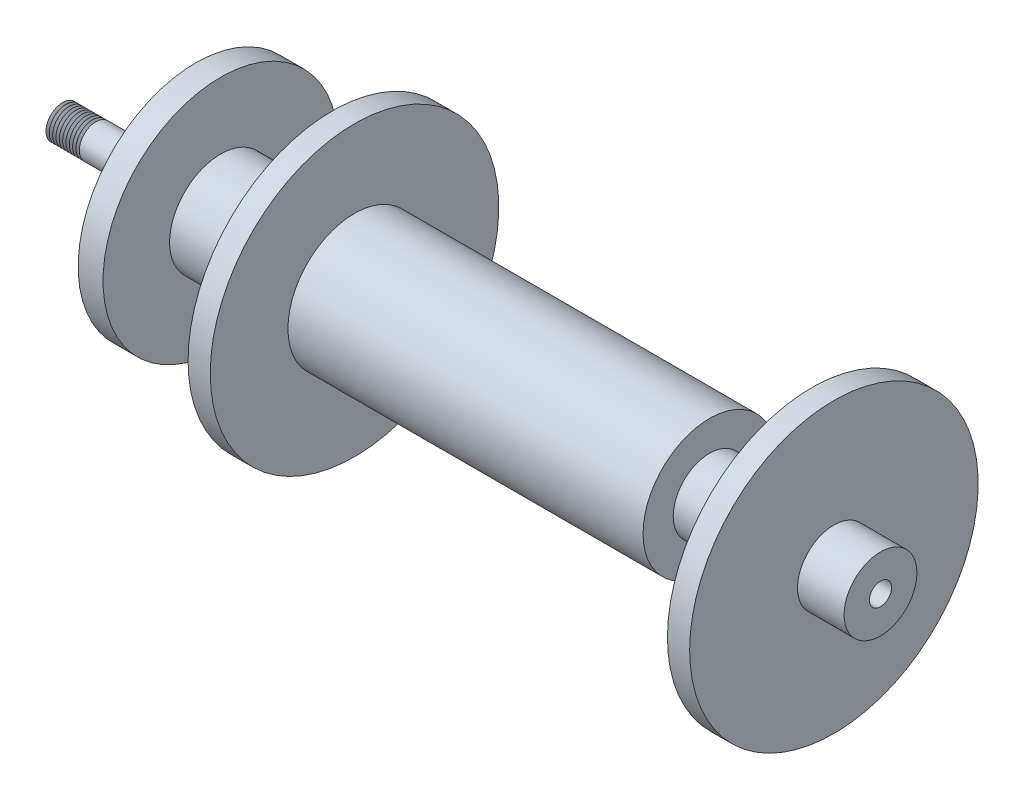
ISO-10303-21;
HEADER;
FILE_DESCRIPTION(('STEP AP214'),'2;1');
FILE_NAME('part.step','',(''),(''),'','','');
FILE_SCHEMA(('AUTOMOTIVE_DESIGN { 1 0 10303 214 1 1 1 1 }'));
ENDSEC;
DATA;
#1=APPLICATION_CONTEXT('core data for automotive mechanical design processes');
#2=APPLICATION_PROTOCOL_DEFINITION('international standard','automotive_design',2000,#1);
#3=PRODUCT_CONTEXT('',#1,'mechanical');
#4=PRODUCT('Part','Part','',(#3));
#5=PRODUCT_RELATED_PRODUCT_CATEGORY('part','',(#4));
#6=PRODUCT_DEFINITION_FORMATION('','',#4);
#7=PRODUCT_DEFINITION_CONTEXT('part definition',#1,'design');
#8=PRODUCT_DEFINITION('design','',#6,#7);
#9=PRODUCT_DEFINITION_SHAPE('','',#8);
#10=(LENGTH_UNIT() NAMED_UNIT(*) SI_UNIT(.MILLI.,.METRE.));
#11=(NAMED_UNIT(*) PLANE_ANGLE_UNIT() SI_UNIT($,.RADIAN.));
#12=(NAMED_UNIT(*) SI_UNIT($,.STERADIAN.) SOLID_ANGLE_UNIT());
#13=UNCERTAINTY_MEASURE_WITH_UNIT(LENGTH_MEASURE(1.E-05),#10,'distance_accuracy_value','');
#14=(GEOMETRIC_REPRESENTATION_CONTEXT(3) GLOBAL_UNCERTAINTY_ASSIGNED_CONTEXT((#13)) GLOBAL_UNIT_ASSIGNED_CONTEXT((#10,
#11,#12)) REPRESENTATION_CONTEXT('',''));
#15=CARTESIAN_POINT('',(0.,0.,0.));
#16=DIRECTION('',(0.,0.,1.));
#17=DIRECTION('',(1.,0.,0.));
#18=AXIS2_PLACEMENT_3D('',#15,#16,#17);
#19=CARTESIAN_POINT('',(-76.0835524418026,0.,0.));
#20=DIRECTION('',(-1.,0.,0.));
#21=DIRECTION('',(0.,0.,1.));
#22=AXIS2_PLACEMENT_3D('',#19,#20,#21);
#23=TOROIDAL_SURFACE('',#22,17.9999865437867,3.00000000000001);
#24=CARTESIAN_POINT('',(-76.0835524418026,0.,20.9999865437867));
#25=VERTEX_POINT('',#24);
#26=VERTEX_LOOP('',#25);
#27=FACE_BOUND('',#26,.T.);
#28=ADVANCED_FACE('F40',(#27),#23,.T.);
#29=CLOSED_SHELL('',(#28));
#30=MANIFOLD_SOLID_BREP('B2',#29);
#31=CARTESIAN_POINT('',(-82.0835524418026,0.,0.));
#32=DIRECTION('',(-1.,0.,0.));
#33=DIRECTION('',(0.,0.,1.));
#34=AXIS2_PLACEMENT_3D('',#31,#32,#33);
#35=TOROIDAL_SURFACE('',#34,17.9999865437867,3.00000000000001);
#36=CARTESIAN_POINT('',(-82.0835524418026,0.,20.9999865437867));
#37=VERTEX_POINT('',#36);
#38=VERTEX_LOOP('',#37);
#39=FACE_BOUND('',#38,.T.);
#40=ADVANCED_FACE('F61',(#39),#35,.T.);
#41=CLOSED_SHELL('',(#40));
#42=MANIFOLD_SOLID_BREP('B6',#41);
#43=CARTESIAN_POINT('',(-198.024312559858,0.,0.));
#44=DIRECTION('',(-1.,0.,0.));
#45=DIRECTION('',(0.,0.,1.));
#46=AXIS2_PLACEMENT_3D('',#43,#44,#45);
#47=CONICAL_SURFACE('',#46,7.50000000000006,1.0471975511966);
#48=CARTESIAN_POINT('',(-197.274312559858,0.,0.));
#49=DIRECTION('',(1.,0.,0.));
#50=DIRECTION('',(0.,0.,-1.));
#51=AXIS2_PLACEMENT_3D('',#48,#49,#50);
#52=CIRCLE('',#51,6.20096189432334);
#53=CARTESIAN_POINT('',(-197.274312559858,0.,-6.20096189432334));
#54=VERTEX_POINT('',#53);
#55=EDGE_CURVE('E169',#54,#54,#52,.T.);
#56=ORIENTED_EDGE('',*,*,#55,.F.);
#57=EDGE_LOOP('',(#56));
#58=FACE_BOUND('',#57,.T.);
#59=CARTESIAN_POINT('',(-198.024312559858,0.,0.));
#60=DIRECTION('',(1.,0.,0.));
#61=DIRECTION('',(0.,0.,-1.));
#62=AXIS2_PLACEMENT_3D('',#59,#60,#61);
#63=CIRCLE('',#62,7.50000000000006);
#64=CARTESIAN_POINT('',(-198.024312559858,0.,-7.50000000000006));
#65=VERTEX_POINT('',#64);
#66=EDGE_CURVE('E60',#65,#65,#63,.T.);
#67=ORIENTED_EDGE('',*,*,#66,.T.);
#68=EDGE_LOOP('',(#67));
#69=FACE_BOUND('',#68,.T.);
#70=ADVANCED_FACE('F81',(#58,#69),#47,.T.);
#71=CARTESIAN_POINT('',(-198.774312559858,0.,0.));
#72=DIRECTION('',(1.,0.,0.));
#73=DIRECTION('',(0.,0.,-1.));
#74=AXIS2_PLACEMENT_3D('',#71,#72,#73);
#75=CONICAL_SURFACE('',#74,6.20096189432333,1.04719755119664);
#76=ORIENTED_EDGE('',*,*,#66,.F.);
#77=EDGE_LOOP('',(#76));
#78=FACE_BOUND('',#77,.T.);
#79=CARTESIAN_POINT('',(-198.774312559858,0.,0.));
#80=DIRECTION('',(1.,0.,0.));
#81=DIRECTION('',(0.,0.,-1.));
#82=AXIS2_PLACEMENT_3D('',#79,#80,#81);
#83=CIRCLE('',#82,6.20096189432333);
#84=CARTESIAN_POINT('',(-198.774312559858,0.,-6.20096189432333));
#85=VERTEX_POINT('',#84);
#86=EDGE_CURVE('E87',#85,#85,#83,.T.);
#87=ORIENTED_EDGE('',*,*,#86,.T.);
#88=EDGE_LOOP('',(#87));
#89=FACE_BOUND('',#88,.T.);
#90=ADVANCED_FACE('F176',(#78,#89),#75,.T.);
#91=CARTESIAN_POINT('',(-199.524312559858,0.,0.));
#92=DIRECTION('',(-1.,0.,0.));
#93=DIRECTION('',(0.,0.,1.));
#94=AXIS2_PLACEMENT_3D('',#91,#92,#93);
#95=CONICAL_SURFACE('',#94,7.50000000000006,1.0471975511966);
#96=ORIENTED_EDGE('',*,*,#86,.F.);
#97=EDGE_LOOP('',(#96));
#98=FACE_BOUND('',#97,.T.);
#99=CARTESIAN_POINT('',(-199.524312559858,0.,0.));
#100=DIRECTION('',(1.,0.,0.));
#101=DIRECTION('',(0.,0.,-1.));
#102=AXIS2_PLACEMENT_3D('',#99,#100,#101);
#103=CIRCLE('',#102,7.50000000000006);
#104=CARTESIAN_POINT('',(-199.524312559858,0.,-7.50000000000006));
#105=VERTEX_POINT('',#104);
#106=EDGE_CURVE('E91',#105,#105,#103,.T.);
#107=ORIENTED_EDGE('',*,*,#106,.T.);
#108=EDGE_LOOP('',(#107));
#109=FACE_BOUND('',#108,.T.);
#110=ADVANCED_FACE('F180',(#98,#109),#95,.T.);
#111=CARTESIAN_POINT('',(-200.274312559858,0.,0.));
#112=DIRECTION('',(1.,0.,0.));
#113=DIRECTION('',(0.,0.,-1.));
#114=AXIS2_PLACEMENT_3D('',#111,#112,#113);
#115=CONICAL_SURFACE('',#114,6.20096189432333,1.04719755119664);
#116=ORIENTED_EDGE('',*,*,#106,.F.);
#117=EDGE_LOOP('',(#116));
#118=FACE_BOUND('',#117,.T.);
#119=CARTESIAN_POINT('',(-200.274312559858,0.,0.));
#120=DIRECTION('',(1.,0.,0.));
#121=DIRECTION('',(0.,0.,-1.));
#122=AXIS2_PLACEMENT_3D('',#119,#120,#121);
#123=CIRCLE('',#122,6.20096189432333);
#124=CARTESIAN_POINT('',(-200.274312559858,0.,-6.20096189432333));
#125=VERTEX_POINT('',#124);
#126=EDGE_CURVE('E95',#125,#125,#123,.T.);
#127=ORIENTED_EDGE('',*,*,#126,.T.);
#128=EDGE_LOOP('',(#127));
#129=FACE_BOUND('',#128,.T.);
#130=ADVANCED_FACE('F185',(#118,#129),#115,.T.);
#131=CARTESIAN_POINT('',(-201.024312559858,0.,0.));
#132=DIRECTION('',(-1.,0.,0.));
#133=DIRECTION('',(0.,0.,1.));
#134=AXIS2_PLACEMENT_3D('',#131,#132,#133);
#135=CONICAL_SURFACE('',#134,7.50000000000006,1.0471975511966);
#136=ORIENTED_EDGE('',*,*,#126,.F.);
#137=EDGE_LOOP('',(#136));
#138=FACE_BOUND('',#137,.T.);
#139=CARTESIAN_POINT('',(-201.024312559858,0.,0.));
#140=DIRECTION('',(1.,0.,0.));
#141=DIRECTION('',(0.,0.,-1.));
#142=AXIS2_PLACEMENT_3D('',#139,#140,#141);
#143=CIRCLE('',#142,7.50000000000006);
#144=CARTESIAN_POINT('',(-201.024312559858,0.,-7.50000000000006));
#145=VERTEX_POINT('',#144);
#146=EDGE_CURVE('E100',#145,#145,#143,.T.);
#147=ORIENTED_EDGE('',*,*,#146,.T.);
#148=EDGE_LOOP('',(#147));
#149=FACE_BOUND('',#148,.T.);
#150=ADVANCED_FACE('F191',(#138,#149),#135,.T.);
#151=CARTESIAN_POINT('',(-201.774312559858,0.,0.));
#152=DIRECTION('',(1.,0.,0.));
#153=DIRECTION('',(0.,0.,-1.));
#154=AXIS2_PLACEMENT_3D('',#151,#152,#153);
#155=CONICAL_SURFACE('',#154,6.20096189432334,1.04719755119663);
#156=ORIENTED_EDGE('',*,*,#146,.F.);
#157=EDGE_LOOP('',(#156));
#158=FACE_BOUND('',#157,.T.);
#159=CARTESIAN_POINT('',(-201.774312559858,0.,0.));
#160=DIRECTION('',(1.,0.,0.));
#161=DIRECTION('',(0.,0.,-1.));
#162=AXIS2_PLACEMENT_3D('',#159,#160,#161);
#163=CIRCLE('',#162,6.20096189432334);
#164=CARTESIAN_POINT('',(-201.774312559858,0.,-6.20096189432334));
#165=VERTEX_POINT('',#164);
#166=EDGE_CURVE('E103',#165,#165,#163,.T.);
#167=ORIENTED_EDGE('',*,*,#166,.T.);
#168=EDGE_LOOP('',(#167));
#169=FACE_BOUND('',#168,.T.);
#170=ADVANCED_FACE('F195',(#158,#169),#155,.T.);
#171=CARTESIAN_POINT('',(-202.524312559858,0.,0.));
#172=DIRECTION('',(-1.,0.,0.));
#173=DIRECTION('',(0.,0.,1.));
#174=AXIS2_PLACEMENT_3D('',#171,#172,#173);
#175=CONICAL_SURFACE('',#174,7.50000000000006,1.0471975511966);
#176=ORIENTED_EDGE('',*,*,#166,.F.);
#177=EDGE_LOOP('',(#176));
#178=FACE_BOUND('',#177,.T.);
#179=CARTESIAN_POINT('',(-202.524312559858,0.,0.));
#180=DIRECTION('',(1.,0.,0.));
#181=DIRECTION('',(0.,0.,-1.));
#182=AXIS2_PLACEMENT_3D('',#179,#180,#181);
#183=CIRCLE('',#182,7.50000000000006);
#184=CARTESIAN_POINT('',(-202.524312559858,0.,-7.50000000000006));
#185=VERTEX_POINT('',#184);
#186=EDGE_CURVE('E106',#185,#185,#183,.T.);
#187=ORIENTED_EDGE('',*,*,#186,.T.);
#188=EDGE_LOOP('',(#187));
#189=FACE_BOUND('',#188,.T.);
#190=ADVANCED_FACE('F199',(#178,#189),#175,.T.);
#191=CARTESIAN_POINT('',(-203.274312559858,0.,0.));
#192=DIRECTION('',(1.,0.,0.));
#193=DIRECTION('',(0.,0.,-1.));
#194=AXIS2_PLACEMENT_3D('',#191,#192,#193);
#195=CONICAL_SURFACE('',#194,6.20096189432334,1.04719755119663);
#196=ORIENTED_EDGE('',*,*,#186,.F.);
#197=EDGE_LOOP('',(#196));
#198=FACE_BOUND('',#197,.T.);
#199=CARTESIAN_POINT('',(-203.274312559858,0.,0.));
#200=DIRECTION('',(1.,0.,0.));
#201=DIRECTION('',(0.,0.,-1.));
#202=AXIS2_PLACEMENT_3D('',#199,#200,#201);
#203=CIRCLE('',#202,6.20096189432334);
#204=CARTESIAN_POINT('',(-203.274312559858,0.,-6.20096189432334));
#205=VERTEX_POINT('',#204);
#206=EDGE_CURVE('E109',#205,#205,#203,.T.);
#207=ORIENTED_EDGE('',*,*,#206,.T.);
#208=EDGE_LOOP('',(#207));
#209=FACE_BOUND('',#208,.T.);
#210=ADVANCED_FACE('F203',(#198,#209),#195,.T.);
#211=CARTESIAN_POINT('',(-204.024312559858,0.,0.));
#212=DIRECTION('',(-1.,0.,0.));
#213=DIRECTION('',(0.,0.,1.));
#214=AXIS2_PLACEMENT_3D('',#211,#212,#213);
#215=CONICAL_SURFACE('',#214,7.50000000000006,1.0471975511966);
#216=ORIENTED_EDGE('',*,*,#206,.F.);
#217=EDGE_LOOP('',(#216));
#218=FACE_BOUND('',#217,.T.);
#219=CARTESIAN_POINT('',(-204.024312559858,0.,0.));
#220=DIRECTION('',(1.,0.,0.));
#221=DIRECTION('',(0.,0.,-1.));
#222=AXIS2_PLACEMENT_3D('',#219,#220,#221);
#223=CIRCLE('',#222,7.50000000000006);
#224=CARTESIAN_POINT('',(-204.024312559858,0.,-7.50000000000006));
#225=VERTEX_POINT('',#224);
#226=EDGE_CURVE('E112',#225,#225,#223,.T.);
#227=ORIENTED_EDGE('',*,*,#226,.T.);
#228=EDGE_LOOP('',(#227));
#229=FACE_BOUND('',#228,.T.);
#230=ADVANCED_FACE('F207',(#218,#229),#215,.T.);
#231=CARTESIAN_POINT('',(-204.774312559858,0.,0.));
#232=DIRECTION('',(1.,0.,0.));
#233=DIRECTION('',(0.,0.,-1.));
#234=AXIS2_PLACEMENT_3D('',#231,#232,#233);
#235=CONICAL_SURFACE('',#234,6.20096189432334,1.04719755119663);
#236=ORIENTED_EDGE('',*,*,#226,.F.);
#237=EDGE_LOOP('',(#236));
#238=FACE_BOUND('',#237,.T.);
#239=CARTESIAN_POINT('',(-204.774312559858,0.,0.));
#240=DIRECTION('',(1.,0.,0.));
#241=DIRECTION('',(0.,0.,-1.));
#242=AXIS2_PLACEMENT_3D('',#239,#240,#241);
#243=CIRCLE('',#242,6.20096189432334);
#244=CARTESIAN_POINT('',(-204.774312559858,0.,-6.20096189432334));
#245=VERTEX_POINT('',#244);
#246=EDGE_CURVE('E115',#245,#245,#243,.T.);
#247=ORIENTED_EDGE('',*,*,#246,.T.);
#248=EDGE_LOOP('',(#247));
#249=FACE_BOUND('',#248,.T.);
#250=ADVANCED_FACE('F211',(#238,#249),#235,.T.);
#251=CARTESIAN_POINT('',(-205.524312559858,0.,0.));
#252=DIRECTION('',(-1.,0.,0.));
#253=DIRECTION('',(0.,0.,1.));
#254=AXIS2_PLACEMENT_3D('',#251,#252,#253);
#255=CONICAL_SURFACE('',#254,7.50000000000005,1.0471975511966);
#256=ORIENTED_EDGE('',*,*,#246,.F.);
#257=EDGE_LOOP('',(#256));
#258=FACE_BOUND('',#257,.T.);
#259=CARTESIAN_POINT('',(-205.524312559858,0.,0.));
#260=DIRECTION('',(1.,0.,0.));
#261=DIRECTION('',(0.,0.,-1.));
#262=AXIS2_PLACEMENT_3D('',#259,#260,#261);
#263=CIRCLE('',#262,7.50000000000005);
#264=CARTESIAN_POINT('',(-205.524312559858,0.,-7.50000000000005));
#265=VERTEX_POINT('',#264);
#266=EDGE_CURVE('E118',#265,#265,#263,.T.);
#267=ORIENTED_EDGE('',*,*,#266,.T.);
#268=EDGE_LOOP('',(#267));
#269=FACE_BOUND('',#268,.T.);
#270=ADVANCED_FACE('F215',(#258,#269),#255,.T.);
#271=CARTESIAN_POINT('',(-206.274312559858,0.,0.));
#272=DIRECTION('',(1.,0.,0.));
#273=DIRECTION('',(0.,0.,-1.));
#274=AXIS2_PLACEMENT_3D('',#271,#272,#273);
#275=CONICAL_SURFACE('',#274,6.20096189432333,1.04719755119663);
#276=ORIENTED_EDGE('',*,*,#266,.F.);
#277=EDGE_LOOP('',(#276));
#278=FACE_BOUND('',#277,.T.);
#279=CARTESIAN_POINT('',(-206.274312559858,0.,0.));
#280=DIRECTION('',(1.,0.,0.));
#281=DIRECTION('',(0.,0.,-1.));
#282=AXIS2_PLACEMENT_3D('',#279,#280,#281);
#283=CIRCLE('',#282,6.20096189432333);
#284=CARTESIAN_POINT('',(-206.274312559858,0.,-6.20096189432333));
#285=VERTEX_POINT('',#284);
#286=EDGE_CURVE('E121',#285,#285,#283,.T.);
#287=ORIENTED_EDGE('',*,*,#286,.T.);
#288=EDGE_LOOP('',(#287));
#289=FACE_BOUND('',#288,.T.);
#290=ADVANCED_FACE('F219',(#278,#289),#275,.T.);
#291=CARTESIAN_POINT('',(-207.024312559858,0.,0.));
#292=DIRECTION('',(-1.,0.,0.));
#293=DIRECTION('',(0.,0.,1.));
#294=AXIS2_PLACEMENT_3D('',#291,#292,#293);
#295=CONICAL_SURFACE('',#294,7.50000000000005,1.0471975511966);
#296=ORIENTED_EDGE('',*,*,#286,.F.);
#297=EDGE_LOOP('',(#296));
#298=FACE_BOUND('',#297,.T.);
#299=CARTESIAN_POINT('',(-207.024312559858,0.,0.));
#300=DIRECTION('',(1.,0.,0.));
#301=DIRECTION('',(0.,0.,-1.));
#302=AXIS2_PLACEMENT_3D('',#299,#300,#301);
#303=CIRCLE('',#302,7.50000000000005);
#304=CARTESIAN_POINT('',(-207.024312559858,0.,-7.50000000000005));
#305=VERTEX_POINT('',#304);
#306=EDGE_CURVE('E124',#305,#305,#303,.T.);
#307=ORIENTED_EDGE('',*,*,#306,.T.);
#308=EDGE_LOOP('',(#307));
#309=FACE_BOUND('',#308,.T.);
#310=ADVANCED_FACE('F223',(#298,#309),#295,.T.);
#311=CARTESIAN_POINT('',(-207.774312559858,0.,0.));
#312=DIRECTION('',(1.,0.,0.));
#313=DIRECTION('',(0.,0.,-1.));
#314=AXIS2_PLACEMENT_3D('',#311,#312,#313);
#315=CONICAL_SURFACE('',#314,6.20096189432333,1.04719755119663);
#316=ORIENTED_EDGE('',*,*,#306,.F.);
#317=EDGE_LOOP('',(#316));
#318=FACE_BOUND('',#317,.T.);
#319=CARTESIAN_POINT('',(-207.774312559858,0.,0.));
#320=DIRECTION('',(1.,0.,0.));
#321=DIRECTION('',(0.,0.,-1.));
#322=AXIS2_PLACEMENT_3D('',#319,#320,#321);
#323=CIRCLE('',#322,6.20096189432333);
#324=CARTESIAN_POINT('',(-207.774312559858,0.,-6.20096189432333));
#325=VERTEX_POINT('',#324);
#326=EDGE_CURVE('E127',#325,#325,#323,.T.);
#327=ORIENTED_EDGE('',*,*,#326,.T.);
#328=EDGE_LOOP('',(#327));
#329=FACE_BOUND('',#328,.T.);
#330=ADVANCED_FACE('F227',(#318,#329),#315,.T.);
#331=CARTESIAN_POINT('',(-208.524312559858,0.,0.));
#332=DIRECTION('',(-1.,0.,0.));
#333=DIRECTION('',(0.,0.,1.));
#334=AXIS2_PLACEMENT_3D('',#331,#332,#333);
#335=CONICAL_SURFACE('',#334,7.50000000000006,1.04719755119661);
#336=ORIENTED_EDGE('',*,*,#326,.F.);
#337=EDGE_LOOP('',(#336));
#338=FACE_BOUND('',#337,.T.);
#339=CARTESIAN_POINT('',(-208.524312559858,0.,0.));
#340=DIRECTION('',(1.,0.,0.));
#341=DIRECTION('',(0.,0.,-1.));
#342=AXIS2_PLACEMENT_3D('',#339,#340,#341);
#343=CIRCLE('',#342,7.50000000000006);
#344=CARTESIAN_POINT('',(-208.524312559858,0.,-7.50000000000006));
#345=VERTEX_POINT('',#344);
#346=EDGE_CURVE('E130',#345,#345,#343,.T.);
#347=ORIENTED_EDGE('',*,*,#346,.T.);
#348=EDGE_LOOP('',(#347));
#349=FACE_BOUND('',#348,.T.);
#350=ADVANCED_FACE('F231',(#338,#349),#335,.T.);
#351=CARTESIAN_POINT('',(-209.274312559858,0.,0.));
#352=DIRECTION('',(1.,0.,0.));
#353=DIRECTION('',(0.,0.,-1.));
#354=AXIS2_PLACEMENT_3D('',#351,#352,#353);
#355=CONICAL_SURFACE('',#354,6.20096189432334,1.04719755119667);
#356=ORIENTED_EDGE('',*,*,#346,.F.);
#357=EDGE_LOOP('',(#356));
#358=FACE_BOUND('',#357,.T.);
#359=CARTESIAN_POINT('',(-209.274312559858,0.,0.));
#360=DIRECTION('',(1.,0.,0.));
#361=DIRECTION('',(0.,0.,-1.));
#362=AXIS2_PLACEMENT_3D('',#359,#360,#361);
#363=CIRCLE('',#362,6.20096189432334);
#364=CARTESIAN_POINT('',(-209.274312559858,0.,-6.20096189432334));
#365=VERTEX_POINT('',#364);
#366=EDGE_CURVE('E133',#365,#365,#363,.T.);
#367=ORIENTED_EDGE('',*,*,#366,.T.);
#368=EDGE_LOOP('',(#367));
#369=FACE_BOUND('',#368,.T.);
#370=ADVANCED_FACE('F235',(#358,#369),#355,.T.);
#371=CARTESIAN_POINT('',(-210.024312559858,0.,0.));
#372=DIRECTION('',(-1.,0.,0.));
#373=DIRECTION('',(0.,0.,1.));
#374=AXIS2_PLACEMENT_3D('',#371,#372,#373);
#375=CONICAL_SURFACE('',#374,7.50000000000006,1.04719755119657);
#376=ORIENTED_EDGE('',*,*,#366,.F.);
#377=EDGE_LOOP('',(#376));
#378=FACE_BOUND('',#377,.T.);
#379=CARTESIAN_POINT('',(-210.024312559858,0.,0.));
#380=DIRECTION('',(1.,0.,0.));
#381=DIRECTION('',(0.,0.,-1.));
#382=AXIS2_PLACEMENT_3D('',#379,#380,#381);
#383=CIRCLE('',#382,7.50000000000006);
#384=CARTESIAN_POINT('',(-210.024312559858,0.,-7.50000000000006));
#385=VERTEX_POINT('',#384);
#386=EDGE_CURVE('E136',#385,#385,#383,.T.);
#387=ORIENTED_EDGE('',*,*,#386,.T.);
#388=EDGE_LOOP('',(#387));
#389=FACE_BOUND('',#388,.T.);
#390=ADVANCED_FACE('F239',(#378,#389),#375,.T.);
#391=CARTESIAN_POINT('',(-210.774312559858,0.,0.));
#392=DIRECTION('',(1.,0.,0.));
#393=DIRECTION('',(0.,0.,-1.));
#394=AXIS2_PLACEMENT_3D('',#391,#392,#393);
#395=CONICAL_SURFACE('',#394,6.20096189432334,1.04719755119663);
#396=ORIENTED_EDGE('',*,*,#386,.F.);
#397=EDGE_LOOP('',(#396));
#398=FACE_BOUND('',#397,.T.);
#399=CARTESIAN_POINT('',(-210.774312559858,0.,0.));
#400=DIRECTION('',(1.,0.,0.));
#401=DIRECTION('',(0.,0.,-1.));
#402=AXIS2_PLACEMENT_3D('',#399,#400,#401);
#403=CIRCLE('',#402,6.20096189432334);
#404=CARTESIAN_POINT('',(-210.774312559858,0.,-6.20096189432334));
#405=VERTEX_POINT('',#404);
#406=EDGE_CURVE('E139',#405,#405,#403,.T.);
#407=ORIENTED_EDGE('',*,*,#406,.T.);
#408=EDGE_LOOP('',(#407));
#409=FACE_BOUND('',#408,.T.);
#410=ADVANCED_FACE('F243',(#398,#409),#395,.T.);
#411=CARTESIAN_POINT('',(-211.524312559858,0.,0.));
#412=DIRECTION('',(-1.,0.,0.));
#413=DIRECTION('',(0.,0.,1.));
#414=AXIS2_PLACEMENT_3D('',#411,#412,#413);
#415=CONICAL_SURFACE('',#414,7.50000000000006,1.0471975511966);
#416=ORIENTED_EDGE('',*,*,#406,.F.);
#417=EDGE_LOOP('',(#416));
#418=FACE_BOUND('',#417,.T.);
#419=CARTESIAN_POINT('',(-211.524312559858,0.,0.));
#420=DIRECTION('',(1.,0.,0.));
#421=DIRECTION('',(0.,0.,-1.));
#422=AXIS2_PLACEMENT_3D('',#419,#420,#421);
#423=CIRCLE('',#422,7.50000000000006);
#424=CARTESIAN_POINT('',(-211.524312559858,0.,-7.50000000000006));
#425=VERTEX_POINT('',#424);
#426=EDGE_CURVE('E142',#425,#425,#423,.T.);
#427=ORIENTED_EDGE('',*,*,#426,.T.);
#428=EDGE_LOOP('',(#427));
#429=FACE_BOUND('',#428,.T.);
#430=ADVANCED_FACE('F247',(#418,#429),#415,.T.);
#431=CARTESIAN_POINT('',(-211.524312559858,0.,0.));
#432=DIRECTION('',(-1.,0.,0.));
#433=DIRECTION('',(0.,0.,1.));
#434=AXIS2_PLACEMENT_3D('',#431,#432,#433);
#435=PLANE('',#434);
#436=ORIENTED_EDGE('',*,*,#426,.F.);
#437=EDGE_LOOP('',(#436));
#438=FACE_BOUND('',#437,.T.);
#439=ADVANCED_FACE('F251',(#438),#435,.T.);
#440=CARTESIAN_POINT('',(9.66815445728479,0.,0.));
#441=DIRECTION('',(-1.,0.,0.));
#442=DIRECTION('',(0.,0.,1.));
#443=AXIS2_PLACEMENT_3D('',#440,#441,#442);
#444=PLANE('',#443);
#445=CARTESIAN_POINT('',(9.66815445728479,0.,0.));
#446=DIRECTION('',(1.,0.,0.));
#447=DIRECTION('',(0.,0.,-1.));
#448=AXIS2_PLACEMENT_3D('',#445,#446,#447);
#449=CIRCLE('',#448,15.);
#450=CARTESIAN_POINT('',(9.66815445728479,0.,-15.));
#451=VERTEX_POINT('',#450);
#452=EDGE_CURVE('E145',#451,#451,#449,.T.);
#453=ORIENTED_EDGE('',*,*,#452,.T.);
#454=EDGE_LOOP('',(#453));
#455=FACE_BOUND('',#454,.T.);
#456=ADVANCED_FACE('F255',(#455),#444,.F.);
#457=CARTESIAN_POINT('',(56.2516611951837,0.,0.));
#458=DIRECTION('',(1.,0.,0.));
#459=DIRECTION('',(0.,0.,-1.));
#460=AXIS2_PLACEMENT_3D('',#457,#458,#459);
#461=CYLINDRICAL_SURFACE('',#460,15.);
#462=CARTESIAN_POINT('',(-115.308411431869,0.,0.));
#463=DIRECTION('',(1.,0.,0.));
#464=DIRECTION('',(0.,0.,-1.));
#465=AXIS2_PLACEMENT_3D('',#462,#463,#464);
#466=CIRCLE('',#465,15.);
#467=CARTESIAN_POINT('',(-115.308411431869,0.,-15.));
#468=VERTEX_POINT('',#467);
#469=EDGE_CURVE('E148',#468,#468,#466,.T.);
#470=ORIENTED_EDGE('',*,*,#469,.T.);
#471=EDGE_LOOP('',(#470));
#472=FACE_BOUND('',#471,.T.);
#473=ORIENTED_EDGE('',*,*,#452,.F.);
#474=EDGE_LOOP('',(#473));
#475=FACE_BOUND('',#474,.T.);
#476=ADVANCED_FACE('F259',(#472,#475),#461,.T.);
#477=CARTESIAN_POINT('',(-115.308411431869,0.,0.));
#478=DIRECTION('',(-1.,0.,0.));
#479=DIRECTION('',(0.,0.,1.));
#480=AXIS2_PLACEMENT_3D('',#477,#478,#479);
#481=PLANE('',#480);
#482=ORIENTED_EDGE('',*,*,#469,.F.);
#483=EDGE_LOOP('',(#482));
#484=FACE_BOUND('',#483,.T.);
#485=CARTESIAN_POINT('',(-115.308411431869,0.,0.));
#486=DIRECTION('',(1.,0.,0.));
#487=DIRECTION('',(0.,0.,-1.));
#488=AXIS2_PLACEMENT_3D('',#485,#486,#487);
#489=CIRCLE('',#488,23.);
#490=CARTESIAN_POINT('',(-115.308411431869,0.,-23.));
#491=VERTEX_POINT('',#490);
#492=EDGE_CURVE('E151',#491,#491,#489,.T.);
#493=ORIENTED_EDGE('',*,*,#492,.T.);
#494=EDGE_LOOP('',(#493));
#495=FACE_BOUND('',#494,.T.);
#496=ADVANCED_FACE('F263',(#484,#495),#481,.F.);
#497=CARTESIAN_POINT('',(56.2516611951837,0.,0.));
#498=DIRECTION('',(1.,0.,0.));
#499=DIRECTION('',(0.,0.,-1.));
#500=AXIS2_PLACEMENT_3D('',#497,#498,#499);
#501=CYLINDRICAL_SURFACE('',#500,23.);
#502=CARTESIAN_POINT('',(-140.308411431869,0.,0.));
#503=DIRECTION('',(1.,0.,0.));
#504=DIRECTION('',(0.,0.,-1.));
#505=AXIS2_PLACEMENT_3D('',#502,#503,#504);
#506=CIRCLE('',#505,23.);
#507=CARTESIAN_POINT('',(-140.308411431869,0.,-23.));
#508=VERTEX_POINT('',#507);
#509=EDGE_CURVE('E154',#508,#508,#506,.T.);
#510=ORIENTED_EDGE('',*,*,#509,.T.);
#511=EDGE_LOOP('',(#510));
#512=FACE_BOUND('',#511,.T.);
#513=ORIENTED_EDGE('',*,*,#492,.F.);
#514=EDGE_LOOP('',(#513));
#515=FACE_BOUND('',#514,.T.);
#516=ADVANCED_FACE('F267',(#512,#515),#501,.T.);
#517=CARTESIAN_POINT('',(-140.308411431869,0.,0.));
#518=DIRECTION('',(1.,0.,0.));
#519=DIRECTION('',(0.,0.,-1.));
#520=AXIS2_PLACEMENT_3D('',#517,#518,#519);
#521=PLANE('',#520);
#522=CARTESIAN_POINT('',(-140.308411431869,0.,0.));
#523=DIRECTION('',(1.,0.,0.));
#524=DIRECTION('',(0.,0.,-1.));
#525=AXIS2_PLACEMENT_3D('',#522,#523,#524);
#526=CIRCLE('',#525,53.);
#527=CARTESIAN_POINT('',(-140.308411431869,0.,-53.));
#528=VERTEX_POINT('',#527);
#529=EDGE_CURVE('E157',#528,#528,#526,.T.);
#530=ORIENTED_EDGE('',*,*,#529,.T.);
#531=EDGE_LOOP('',(#530));
#532=FACE_BOUND('',#531,.T.);
#533=ORIENTED_EDGE('',*,*,#509,.F.);
#534=EDGE_LOOP('',(#533));
#535=FACE_BOUND('',#534,.T.);
#536=ADVANCED_FACE('F271',(#532,#535),#521,.T.);
#537=CARTESIAN_POINT('',(56.2516611951837,0.,0.));
#538=DIRECTION('',(1.,0.,0.));
#539=DIRECTION('',(0.,0.,-1.));
#540=AXIS2_PLACEMENT_3D('',#537,#538,#539);
#541=CYLINDRICAL_SURFACE('',#540,53.);
#542=CARTESIAN_POINT('',(-151.524312559858,0.,0.));
#543=DIRECTION('',(1.,0.,0.));
#544=DIRECTION('',(0.,0.,-1.));
#545=AXIS2_PLACEMENT_3D('',#542,#543,#544);
#546=CIRCLE('',#545,53.);
#547=CARTESIAN_POINT('',(-151.524312559858,0.,-53.));
#548=VERTEX_POINT('',#547);
#549=EDGE_CURVE('E160',#548,#548,#546,.T.);
#550=ORIENTED_EDGE('',*,*,#549,.T.);
#551=EDGE_LOOP('',(#550));
#552=FACE_BOUND('',#551,.T.);
#553=ORIENTED_EDGE('',*,*,#529,.F.);
#554=EDGE_LOOP('',(#553));
#555=FACE_BOUND('',#554,.T.);
#556=ADVANCED_FACE('F275',(#552,#555),#541,.T.);
#557=CARTESIAN_POINT('',(-151.524312559858,0.,0.));
#558=DIRECTION('',(-1.,0.,0.));
#559=DIRECTION('',(0.,0.,1.));
#560=AXIS2_PLACEMENT_3D('',#557,#558,#559);
#561=PLANE('',#560);
#562=CARTESIAN_POINT('',(-151.524312559858,0.,0.));
#563=DIRECTION('',(1.,0.,0.));
#564=DIRECTION('',(0.,0.,-1.));
#565=AXIS2_PLACEMENT_3D('',#562,#563,#564);
#566=CIRCLE('',#565,7.5);
#567=CARTESIAN_POINT('',(-151.524312559858,0.,-7.5));
#568=VERTEX_POINT('',#567);
#569=EDGE_CURVE('E163',#568,#568,#566,.T.);
#570=ORIENTED_EDGE('',*,*,#569,.T.);
#571=EDGE_LOOP('',(#570));
#572=FACE_BOUND('',#571,.T.);
#573=ORIENTED_EDGE('',*,*,#549,.F.);
#574=EDGE_LOOP('',(#573));
#575=FACE_BOUND('',#574,.T.);
#576=ADVANCED_FACE('F279',(#572,#575),#561,.T.);
#577=CARTESIAN_POINT('',(56.2516611951837,0.,0.));
#578=DIRECTION('',(1.,0.,0.));
#579=DIRECTION('',(0.,0.,-1.));
#580=AXIS2_PLACEMENT_3D('',#577,#578,#579);
#581=CYLINDRICAL_SURFACE('',#580,7.49999999999996);
#582=ORIENTED_EDGE('',*,*,#569,.F.);
#583=EDGE_LOOP('',(#582));
#584=FACE_BOUND('',#583,.T.);
#585=CARTESIAN_POINT('',(-196.524312559858,0.,0.));
#586=DIRECTION('',(1.,0.,0.));
#587=DIRECTION('',(0.,0.,-1.));
#588=AXIS2_PLACEMENT_3D('',#585,#586,#587);
#589=CIRCLE('',#588,7.49999999999991);
#590=CARTESIAN_POINT('',(-196.524312559858,0.,-7.49999999999991));
#591=VERTEX_POINT('',#590);
#592=EDGE_CURVE('E166',#591,#591,#589,.T.);
#593=ORIENTED_EDGE('',*,*,#592,.T.);
#594=EDGE_LOOP('',(#593));
#595=FACE_BOUND('',#594,.T.);
#596=ADVANCED_FACE('F283',(#584,#595),#581,.T.);
#597=CARTESIAN_POINT('',(-197.274312559858,0.,0.));
#598=DIRECTION('',(1.,0.,0.));
#599=DIRECTION('',(0.,0.,-1.));
#600=AXIS2_PLACEMENT_3D('',#597,#598,#599);
#601=CONICAL_SURFACE('',#600,6.20096189432334,1.04719755119658);
#602=ORIENTED_EDGE('',*,*,#592,.F.);
#603=EDGE_LOOP('',(#602));
#604=FACE_BOUND('',#603,.T.);
#605=ORIENTED_EDGE('',*,*,#55,.T.);
#606=EDGE_LOOP('',(#605));
#607=FACE_BOUND('',#606,.T.);
#608=ADVANCED_FACE('F173',(#604,#607),#601,.T.);
#609=CLOSED_SHELL('',(#70,#90,#110,#130,#150,#170,#190,#210,#230,#250,#270,#290,#310,#330,#350,
#370,#390,#410,#430,#439,#456,#476,#496,#516,#536,#556,#576,#596,#608));
#610=MANIFOLD_SOLID_BREP('B36',#609);
#611=CARTESIAN_POINT('',(-200.777867174281,0.,0.));
#612=DIRECTION('',(-1.,0.,0.));
#613=DIRECTION('',(0.,0.,1.));
#614=AXIS2_PLACEMENT_3D('',#611,#612,#613);
#615=CYLINDRICAL_SURFACE('',#614,20.);
#616=CARTESIAN_POINT('',(60.,0.,0.));
#617=DIRECTION('',(-1.,0.,0.));
#618=DIRECTION('',(0.,0.,1.));
#619=AXIS2_PLACEMENT_3D('',#616,#617,#618);
#620=CIRCLE('',#619,20.);
#621=CARTESIAN_POINT('',(60.,0.,20.));
#622=VERTEX_POINT('',#621);
#623=EDGE_CURVE('E554',#622,#622,#620,.T.);
#624=ORIENTED_EDGE('',*,*,#623,.F.);
#625=EDGE_LOOP('',(#624));
#626=FACE_BOUND('',#625,.T.);
#627=CARTESIAN_POINT('',(-73.0835524418026,0.,0.));
#628=DIRECTION('',(-1.,0.,0.));
#629=DIRECTION('',(0.,0.,1.));
#630=AXIS2_PLACEMENT_3D('',#627,#628,#629);
#631=CIRCLE('',#630,20.);
#632=CARTESIAN_POINT('',(-73.0835524418026,0.,20.));
#633=VERTEX_POINT('',#632);
#634=EDGE_CURVE('E534',#633,#633,#631,.T.);
#635=ORIENTED_EDGE('',*,*,#634,.T.);
#636=EDGE_LOOP('',(#635));
#637=FACE_BOUND('',#636,.T.);
#638=ADVANCED_FACE('F518',(#626,#637),#615,.F.);
#639=CARTESIAN_POINT('',(146.982260796704,0.,0.));
#640=DIRECTION('',(-1.,0.,0.));
#641=DIRECTION('',(0.,0.,1.));
#642=AXIS2_PLACEMENT_3D('',#639,#640,#641);
#643=PLANE('',#642);
#644=CARTESIAN_POINT('',(146.982260796704,0.,0.));
#645=DIRECTION('',(-1.,0.,0.));
#646=DIRECTION('',(0.,0.,1.));
#647=AXIS2_PLACEMENT_3D('',#644,#645,#646);
#648=CIRCLE('',#647,5.);
#649=CARTESIAN_POINT('',(146.982260796704,0.,5.));
#650=VERTEX_POINT('',#649);
#651=EDGE_CURVE('E80',#650,#650,#648,.T.);
#652=ORIENTED_EDGE('',*,*,#651,.F.);
#653=EDGE_LOOP('',(#652));
#654=FACE_BOUND('',#653,.T.);
#655=CARTESIAN_POINT('',(146.982260796704,0.,0.));
#656=DIRECTION('',(-1.,0.,0.));
#657=DIRECTION('',(0.,0.,1.));
#658=AXIS2_PLACEMENT_3D('',#655,#656,#657);
#659=CIRCLE('',#658,2.5);
#660=CARTESIAN_POINT('',(146.982260796704,0.,2.5));
#661=VERTEX_POINT('',#660);
#662=EDGE_CURVE('E540',#661,#661,#659,.T.);
#663=ORIENTED_EDGE('',*,*,#662,.T.);
#664=EDGE_LOOP('',(#663));
#665=FACE_BOUND('',#664,.T.);
#666=ADVANCED_FACE('F520',(#654,#665),#643,.F.);
#667=CARTESIAN_POINT('',(-200.777867174281,0.,0.));
#668=DIRECTION('',(-1.,0.,0.));
#669=DIRECTION('',(0.,0.,1.));
#670=AXIS2_PLACEMENT_3D('',#667,#668,#669);
#671=CYLINDRICAL_SURFACE('',#670,5.);
#672=CARTESIAN_POINT('',(156.982260796704,0.,0.));
#673=DIRECTION('',(-1.,0.,0.));
#674=DIRECTION('',(0.,0.,1.));
#675=AXIS2_PLACEMENT_3D('',#672,#673,#674);
#676=CIRCLE('',#675,5.);
#677=CARTESIAN_POINT('',(156.982260796704,0.,5.));
#678=VERTEX_POINT('',#677);
#679=EDGE_CURVE('E526',#678,#678,#676,.T.);
#680=ORIENTED_EDGE('',*,*,#679,.F.);
#681=EDGE_LOOP('',(#680));
#682=FACE_BOUND('',#681,.T.);
#683=ORIENTED_EDGE('',*,*,#651,.T.);
#684=EDGE_LOOP('',(#683));
#685=FACE_BOUND('',#684,.T.);
#686=ADVANCED_FACE('F600',(#682,#685),#671,.F.);
#687=CARTESIAN_POINT('',(156.982260796704,0.,0.));
#688=DIRECTION('',(1.,0.,0.));
#689=DIRECTION('',(0.,0.,-1.));
#690=AXIS2_PLACEMENT_3D('',#687,#688,#689);
#691=PLANE('',#690);
#692=ORIENTED_EDGE('',*,*,#679,.T.);
#693=EDGE_LOOP('',(#692));
#694=FACE_BOUND('',#693,.T.);
#695=CARTESIAN_POINT('',(156.982260796704,0.,0.));
#696=DIRECTION('',(-1.,0.,0.));
#697=DIRECTION('',(0.,0.,1.));
#698=AXIS2_PLACEMENT_3D('',#695,#696,#697);
#699=CIRCLE('',#698,16.4047096905881);
#700=CARTESIAN_POINT('',(156.982260796704,0.,16.4047096905881));
#701=VERTEX_POINT('',#700);
#702=EDGE_CURVE('E531',#701,#701,#699,.T.);
#703=ORIENTED_EDGE('',*,*,#702,.F.);
#704=EDGE_LOOP('',(#703));
#705=FACE_BOUND('',#704,.T.);
#706=ADVANCED_FACE('F598',(#694,#705),#691,.T.);
#707=CARTESIAN_POINT('',(-200.777867174281,0.,0.));
#708=DIRECTION('',(-1.,0.,0.));
#709=DIRECTION('',(0.,0.,1.));
#710=AXIS2_PLACEMENT_3D('',#707,#708,#709);
#711=CYLINDRICAL_SURFACE('',#710,16.4047096905881);
#712=ORIENTED_EDGE('',*,*,#702,.T.);
#713=EDGE_LOOP('',(#712));
#714=FACE_BOUND('',#713,.T.);
#715=CARTESIAN_POINT('',(136.,0.,0.));
#716=DIRECTION('',(-1.,0.,0.));
#717=DIRECTION('',(0.,0.,1.));
#718=AXIS2_PLACEMENT_3D('',#715,#716,#717);
#719=CIRCLE('',#718,16.4047096905881);
#720=CARTESIAN_POINT('',(136.,0.,16.4047096905881));
#721=VERTEX_POINT('',#720);
#722=EDGE_CURVE('E590',#721,#721,#719,.T.);
#723=ORIENTED_EDGE('',*,*,#722,.F.);
#724=EDGE_LOOP('',(#723));
#725=FACE_BOUND('',#724,.T.);
#726=ADVANCED_FACE('F595',(#714,#725),#711,.T.);
#727=CARTESIAN_POINT('',(136.,0.,0.));
#728=DIRECTION('',(1.,0.,0.));
#729=DIRECTION('',(0.,0.,-1.));
#730=AXIS2_PLACEMENT_3D('',#727,#728,#729);
#731=PLANE('',#730);
#732=ORIENTED_EDGE('',*,*,#722,.T.);
#733=EDGE_LOOP('',(#732));
#734=FACE_BOUND('',#733,.T.);
#735=CARTESIAN_POINT('',(136.,0.,0.));
#736=DIRECTION('',(-1.,0.,0.));
#737=DIRECTION('',(0.,0.,1.));
#738=AXIS2_PLACEMENT_3D('',#735,#736,#737);
#739=CIRCLE('',#738,65.);
#740=CARTESIAN_POINT('',(136.,0.,65.));
#741=VERTEX_POINT('',#740);
#742=EDGE_CURVE('E587',#741,#741,#739,.T.);
#743=ORIENTED_EDGE('',*,*,#742,.F.);
#744=EDGE_LOOP('',(#743));
#745=FACE_BOUND('',#744,.T.);
#746=ADVANCED_FACE('F607',(#734,#745),#731,.T.);
#747=CARTESIAN_POINT('',(-200.777867174281,0.,0.));
#748=DIRECTION('',(-1.,0.,0.));
#749=DIRECTION('',(0.,0.,1.));
#750=AXIS2_PLACEMENT_3D('',#747,#748,#749);
#751=CYLINDRICAL_SURFACE('',#750,65.);
#752=ORIENTED_EDGE('',*,*,#742,.T.);
#753=EDGE_LOOP('',(#752));
#754=FACE_BOUND('',#753,.T.);
#755=CARTESIAN_POINT('',(126.,0.,0.));
#756=DIRECTION('',(-1.,0.,0.));
#757=DIRECTION('',(0.,0.,1.));
#758=AXIS2_PLACEMENT_3D('',#755,#756,#757);
#759=CIRCLE('',#758,65.);
#760=CARTESIAN_POINT('',(126.,0.,65.));
#761=VERTEX_POINT('',#760);
#762=EDGE_CURVE('E584',#761,#761,#759,.T.);
#763=ORIENTED_EDGE('',*,*,#762,.F.);
#764=EDGE_LOOP('',(#763));
#765=FACE_BOUND('',#764,.T.);
#766=ADVANCED_FACE('F661',(#754,#765),#751,.T.);
#767=CARTESIAN_POINT('',(126.,0.,0.));
#768=DIRECTION('',(-1.,0.,0.));
#769=DIRECTION('',(0.,0.,1.));
#770=AXIS2_PLACEMENT_3D('',#767,#768,#769);
#771=PLANE('',#770);
#772=ORIENTED_EDGE('',*,*,#762,.T.);
#773=EDGE_LOOP('',(#772));
#774=FACE_BOUND('',#773,.T.);
#775=CARTESIAN_POINT('',(126.,0.,0.));
#776=DIRECTION('',(-1.,0.,0.));
#777=DIRECTION('',(0.,0.,1.));
#778=AXIS2_PLACEMENT_3D('',#775,#776,#777);
#779=CIRCLE('',#778,30.);
#780=CARTESIAN_POINT('',(126.,0.,30.));
#781=VERTEX_POINT('',#780);
#782=EDGE_CURVE('E581',#781,#781,#779,.T.);
#783=ORIENTED_EDGE('',*,*,#782,.F.);
#784=EDGE_LOOP('',(#783));
#785=FACE_BOUND('',#784,.T.);
#786=ADVANCED_FACE('F657',(#774,#785),#771,.T.);
#787=CARTESIAN_POINT('',(-200.777867174281,0.,0.));
#788=DIRECTION('',(-1.,0.,0.));
#789=DIRECTION('',(0.,0.,1.));
#790=AXIS2_PLACEMENT_3D('',#787,#788,#789);
#791=CYLINDRICAL_SURFACE('',#790,30.);
#792=ORIENTED_EDGE('',*,*,#782,.T.);
#793=EDGE_LOOP('',(#792));
#794=FACE_BOUND('',#793,.T.);
#795=CARTESIAN_POINT('',(104.164354305885,0.,0.));
#796=DIRECTION('',(-1.,0.,0.));
#797=DIRECTION('',(0.,0.,1.));
#798=AXIS2_PLACEMENT_3D('',#795,#796,#797);
#799=CIRCLE('',#798,30.);
#800=CARTESIAN_POINT('',(104.164354305885,0.,30.));
#801=VERTEX_POINT('',#800);
#802=EDGE_CURVE('E578',#801,#801,#799,.T.);
#803=ORIENTED_EDGE('',*,*,#802,.F.);
#804=EDGE_LOOP('',(#803));
#805=FACE_BOUND('',#804,.T.);
#806=ADVANCED_FACE('F653',(#794,#805),#791,.T.);
#807=CARTESIAN_POINT('',(104.164354305885,0.,0.));
#808=DIRECTION('',(1.,0.,0.));
#809=DIRECTION('',(0.,0.,-1.));
#810=AXIS2_PLACEMENT_3D('',#807,#808,#809);
#811=CONICAL_SURFACE('',#810,30.,1.39626340159546);
#812=CARTESIAN_POINT('',(101.767137813771,0.,0.));
#813=DIRECTION('',(-1.,0.,0.));
#814=DIRECTION('',(0.,0.,1.));
#815=AXIS2_PLACEMENT_3D('',#812,#813,#814);
#816=CIRCLE('',#815,16.4047096905881);
#817=CARTESIAN_POINT('',(101.767137813771,0.,16.4047096905881));
#818=VERTEX_POINT('',#817);
#819=EDGE_CURVE('E575',#818,#818,#816,.T.);
#820=ORIENTED_EDGE('',*,*,#819,.F.);
#821=EDGE_LOOP('',(#820));
#822=FACE_BOUND('',#821,.T.);
#823=ORIENTED_EDGE('',*,*,#802,.T.);
#824=EDGE_LOOP('',(#823));
#825=FACE_BOUND('',#824,.T.);
#826=ADVANCED_FACE('F649',(#822,#825),#811,.T.);
#827=ORIENTED_EDGE('',*,*,#819,.T.);
#828=EDGE_LOOP('',(#827));
#829=FACE_BOUND('',#828,.T.);
#830=CARTESIAN_POINT('',(80.,0.,0.));
#831=DIRECTION('',(-1.,0.,0.));
#832=DIRECTION('',(0.,0.,1.));
#833=AXIS2_PLACEMENT_3D('',#830,#831,#832);
#834=CIRCLE('',#833,16.4047096905881);
#835=CARTESIAN_POINT('',(80.,0.,16.4047096905881));
#836=VERTEX_POINT('',#835);
#837=EDGE_CURVE('E572',#836,#836,#834,.T.);
#838=ORIENTED_EDGE('',*,*,#837,.F.);
#839=EDGE_LOOP('',(#838));
#840=FACE_BOUND('',#839,.T.);
#841=ADVANCED_FACE('F609',(#829,#840),#711,.T.);
#842=CARTESIAN_POINT('',(80.,0.,0.));
#843=DIRECTION('',(1.,0.,0.));
#844=DIRECTION('',(0.,0.,-1.));
#845=AXIS2_PLACEMENT_3D('',#842,#843,#844);
#846=PLANE('',#845);
#847=ORIENTED_EDGE('',*,*,#837,.T.);
#848=EDGE_LOOP('',(#847));
#849=FACE_BOUND('',#848,.T.);
#850=CARTESIAN_POINT('',(80.,0.,0.));
#851=DIRECTION('',(-1.,0.,0.));
#852=DIRECTION('',(0.,0.,1.));
#853=AXIS2_PLACEMENT_3D('',#850,#851,#852);
#854=CIRCLE('',#853,30.);
#855=CARTESIAN_POINT('',(80.,0.,30.));
#856=VERTEX_POINT('',#855);
#857=EDGE_CURVE('E569',#856,#856,#854,.T.);
#858=ORIENTED_EDGE('',*,*,#857,.F.);
#859=EDGE_LOOP('',(#858));
#860=FACE_BOUND('',#859,.T.);
#861=ADVANCED_FACE('F643',(#849,#860),#846,.T.);
#862=CARTESIAN_POINT('',(-200.777867174281,0.,0.));
#863=DIRECTION('',(-1.,0.,0.));
#864=DIRECTION('',(0.,0.,1.));
#865=AXIS2_PLACEMENT_3D('',#862,#863,#864);
#866=CYLINDRICAL_SURFACE('',#865,30.);
#867=ORIENTED_EDGE('',*,*,#857,.T.);
#868=EDGE_LOOP('',(#867));
#869=FACE_BOUND('',#868,.T.);
#870=CARTESIAN_POINT('',(-80.,0.,0.));
#871=DIRECTION('',(-1.,0.,0.));
#872=DIRECTION('',(0.,0.,1.));
#873=AXIS2_PLACEMENT_3D('',#870,#871,#872);
#874=CIRCLE('',#873,30.);
#875=CARTESIAN_POINT('',(-80.,0.,30.));
#876=VERTEX_POINT('',#875);
#877=EDGE_CURVE('E566',#876,#876,#874,.T.);
#878=ORIENTED_EDGE('',*,*,#877,.F.);
#879=EDGE_LOOP('',(#878));
#880=FACE_BOUND('',#879,.T.);
#881=ADVANCED_FACE('F639',(#869,#880),#866,.T.);
#882=CARTESIAN_POINT('',(-80.,0.,0.));
#883=DIRECTION('',(1.,0.,0.));
#884=DIRECTION('',(0.,0.,-1.));
#885=AXIS2_PLACEMENT_3D('',#882,#883,#884);
#886=PLANE('',#885);
#887=ORIENTED_EDGE('',*,*,#877,.T.);
#888=EDGE_LOOP('',(#887));
#889=FACE_BOUND('',#888,.T.);
#890=CARTESIAN_POINT('',(-80.,0.,0.));
#891=DIRECTION('',(-1.,0.,0.));
#892=DIRECTION('',(0.,0.,1.));
#893=AXIS2_PLACEMENT_3D('',#890,#891,#892);
#894=CIRCLE('',#893,65.);
#895=CARTESIAN_POINT('',(-80.,0.,65.));
#896=VERTEX_POINT('',#895);
#897=EDGE_CURVE('E563',#896,#896,#894,.T.);
#898=ORIENTED_EDGE('',*,*,#897,.F.);
#899=EDGE_LOOP('',(#898));
#900=FACE_BOUND('',#899,.T.);
#901=ADVANCED_FACE('F635',(#889,#900),#886,.T.);
#902=CARTESIAN_POINT('',(-200.777867174281,0.,0.));
#903=DIRECTION('',(-1.,0.,0.));
#904=DIRECTION('',(0.,0.,1.));
#905=AXIS2_PLACEMENT_3D('',#902,#903,#904);
#906=CYLINDRICAL_SURFACE('',#905,65.);
#907=ORIENTED_EDGE('',*,*,#897,.T.);
#908=EDGE_LOOP('',(#907));
#909=FACE_BOUND('',#908,.T.);
#910=CARTESIAN_POINT('',(-90.,0.,0.));
#911=DIRECTION('',(-1.,0.,0.));
#912=DIRECTION('',(0.,0.,1.));
#913=AXIS2_PLACEMENT_3D('',#910,#911,#912);
#914=CIRCLE('',#913,65.);
#915=CARTESIAN_POINT('',(-90.,0.,65.));
#916=VERTEX_POINT('',#915);
#917=EDGE_CURVE('E560',#916,#916,#914,.T.);
#918=ORIENTED_EDGE('',*,*,#917,.F.);
#919=EDGE_LOOP('',(#918));
#920=FACE_BOUND('',#919,.T.);
#921=ADVANCED_FACE('F631',(#909,#920),#906,.T.);
#922=CARTESIAN_POINT('',(-90.,0.,0.));
#923=DIRECTION('',(-1.,0.,0.));
#924=DIRECTION('',(0.,0.,1.));
#925=AXIS2_PLACEMENT_3D('',#922,#923,#924);
#926=PLANE('',#925);
#927=ORIENTED_EDGE('',*,*,#917,.T.);
#928=EDGE_LOOP('',(#927));
#929=FACE_BOUND('',#928,.T.);
#930=CARTESIAN_POINT('',(-90.,0.,0.));
#931=DIRECTION('',(-1.,0.,0.));
#932=DIRECTION('',(0.,0.,1.));
#933=AXIS2_PLACEMENT_3D('',#930,#931,#932);
#934=CIRCLE('',#933,20.);
#935=CARTESIAN_POINT('',(-90.,0.,20.));
#936=VERTEX_POINT('',#935);
#937=EDGE_CURVE('E557',#936,#936,#934,.T.);
#938=ORIENTED_EDGE('',*,*,#937,.F.);
#939=EDGE_LOOP('',(#938));
#940=FACE_BOUND('',#939,.T.);
#941=ADVANCED_FACE('F627',(#929,#940),#926,.T.);
#942=CARTESIAN_POINT('',(-200.777867174281,0.,0.));
#943=DIRECTION('',(-1.,0.,0.));
#944=DIRECTION('',(0.,0.,1.));
#945=AXIS2_PLACEMENT_3D('',#942,#943,#944);
#946=CYLINDRICAL_SURFACE('',#945,20.);
#947=CARTESIAN_POINT('',(-85.0835524418026,0.,0.));
#948=DIRECTION('',(-1.,0.,0.));
#949=DIRECTION('',(0.,0.,1.));
#950=AXIS2_PLACEMENT_3D('',#947,#948,#949);
#951=CIRCLE('',#950,20.);
#952=CARTESIAN_POINT('',(-85.0835524418026,0.,20.));
#953=VERTEX_POINT('',#952);
#954=EDGE_CURVE('E522',#953,#953,#951,.T.);
#955=ORIENTED_EDGE('',*,*,#954,.F.);
#956=EDGE_LOOP('',(#955));
#957=FACE_BOUND('',#956,.T.);
#958=ORIENTED_EDGE('',*,*,#937,.T.);
#959=EDGE_LOOP('',(#958));
#960=FACE_BOUND('',#959,.T.);
#961=ADVANCED_FACE('F624',(#957,#960),#946,.F.);
#962=CARTESIAN_POINT('',(60.,0.,0.));
#963=DIRECTION('',(1.,0.,0.));
#964=DIRECTION('',(0.,0.,-1.));
#965=AXIS2_PLACEMENT_3D('',#962,#963,#964);
#966=PLANE('',#965);
#967=CARTESIAN_POINT('',(60.,0.,0.));
#968=DIRECTION('',(-1.,0.,0.));
#969=DIRECTION('',(0.,0.,1.));
#970=AXIS2_PLACEMENT_3D('',#967,#968,#969);
#971=CIRCLE('',#970,2.5);
#972=CARTESIAN_POINT('',(60.,0.,2.5));
#973=VERTEX_POINT('',#972);
#974=EDGE_CURVE('E551',#973,#973,#971,.T.);
#975=ORIENTED_EDGE('',*,*,#974,.F.);
#976=EDGE_LOOP('',(#975));
#977=FACE_BOUND('',#976,.T.);
#978=ORIENTED_EDGE('',*,*,#623,.T.);
#979=EDGE_LOOP('',(#978));
#980=FACE_BOUND('',#979,.T.);
#981=ADVANCED_FACE('F622',(#977,#980),#966,.F.);
#982=CARTESIAN_POINT('',(-200.777867174281,0.,0.));
#983=DIRECTION('',(-1.,0.,0.));
#984=DIRECTION('',(0.,0.,1.));
#985=AXIS2_PLACEMENT_3D('',#982,#983,#984);
#986=CYLINDRICAL_SURFACE('',#985,2.5);
#987=ORIENTED_EDGE('',*,*,#662,.F.);
#988=EDGE_LOOP('',(#987));
#989=FACE_BOUND('',#988,.T.);
#990=ORIENTED_EDGE('',*,*,#974,.T.);
#991=EDGE_LOOP('',(#990));
#992=FACE_BOUND('',#991,.T.);
#993=ADVANCED_FACE('F732',(#989,#992),#986,.F.);
#994=CARTESIAN_POINT('',(-73.0835524418026,0.,0.));
#995=DIRECTION('',(-1.,0.,0.));
#996=DIRECTION('',(0.,0.,1.));
#997=AXIS2_PLACEMENT_3D('',#994,#995,#996);
#998=PLANE('',#997);
#999=ORIENTED_EDGE('',*,*,#634,.F.);
#1000=EDGE_LOOP('',(#999));
#1001=FACE_BOUND('',#1000,.T.);
#1002=CARTESIAN_POINT('',(-73.0835524418026,0.,0.));
#1003=DIRECTION('',(-1.,0.,0.));
#1004=DIRECTION('',(0.,0.,1.));
#1005=AXIS2_PLACEMENT_3D('',#1002,#1003,#1004);
#1006=CIRCLE('',#1005,20.9999865437867);
#1007=CARTESIAN_POINT('',(-73.0835524418026,0.,20.9999865437867));
#1008=VERTEX_POINT('',#1007);
#1009=EDGE_CURVE('E542',#1008,#1008,#1006,.T.);
#1010=ORIENTED_EDGE('',*,*,#1009,.T.);
#1011=EDGE_LOOP('',(#1010));
#1012=FACE_BOUND('',#1011,.T.);
#1013=ADVANCED_FACE('F739',(#1001,#1012),#998,.T.);
#1014=CARTESIAN_POINT('',(-85.0835524418026,0.,0.));
#1015=DIRECTION('',(-1.,0.,0.));
#1016=DIRECTION('',(0.,0.,1.));
#1017=AXIS2_PLACEMENT_3D('',#1014,#1015,#1016);
#1018=PLANE('',#1017);
#1019=ORIENTED_EDGE('',*,*,#954,.T.);
#1020=EDGE_LOOP('',(#1019));
#1021=FACE_BOUND('',#1020,.T.);
#1022=CARTESIAN_POINT('',(-85.0835524418026,0.,0.));
#1023=DIRECTION('',(-1.,0.,0.));
#1024=DIRECTION('',(0.,0.,1.));
#1025=AXIS2_PLACEMENT_3D('',#1022,#1023,#1024);
#1026=CIRCLE('',#1025,20.9999865437867);
#1027=CARTESIAN_POINT('',(-85.0835524418026,0.,20.9999865437867));
#1028=VERTEX_POINT('',#1027);
#1029=EDGE_CURVE('E536',#1028,#1028,#1026,.T.);
#1030=ORIENTED_EDGE('',*,*,#1029,.F.);
#1031=EDGE_LOOP('',(#1030));
#1032=FACE_BOUND('',#1031,.T.);
#1033=ADVANCED_FACE('F745',(#1021,#1032),#1018,.F.);
#1034=CARTESIAN_POINT('',(-115.308411431869,0.,0.));
#1035=DIRECTION('',(-1.,0.,0.));
#1036=DIRECTION('',(0.,0.,1.));
#1037=AXIS2_PLACEMENT_3D('',#1034,#1035,#1036);
#1038=CYLINDRICAL_SURFACE('',#1037,20.9999865437867);
#1039=ORIENTED_EDGE('',*,*,#1009,.F.);
#1040=EDGE_LOOP('',(#1039));
#1041=FACE_BOUND('',#1040,.T.);
#1042=ORIENTED_EDGE('',*,*,#1029,.T.);
#1043=EDGE_LOOP('',(#1042));
#1044=FACE_BOUND('',#1043,.T.);
#1045=ADVANCED_FACE('F753',(#1041,#1044),#1038,.F.);
#1046=CLOSED_SHELL('',(#638,#666,#686,#706,#726,#746,#766,#786,#806,#826,#841,#861,#881,#901,
#921,#941,#961,#981,#993,#1013,#1033,#1045));
#1047=MANIFOLD_SOLID_BREP('B55',#1046);
#1048=ADVANCED_BREP_SHAPE_REPRESENTATION('',(#18,#30,#42,#610,#1047),#14);
#1049=SHAPE_DEFINITION_REPRESENTATION(#9,#1048);
ENDSEC;
END-ISO-10303-21;
